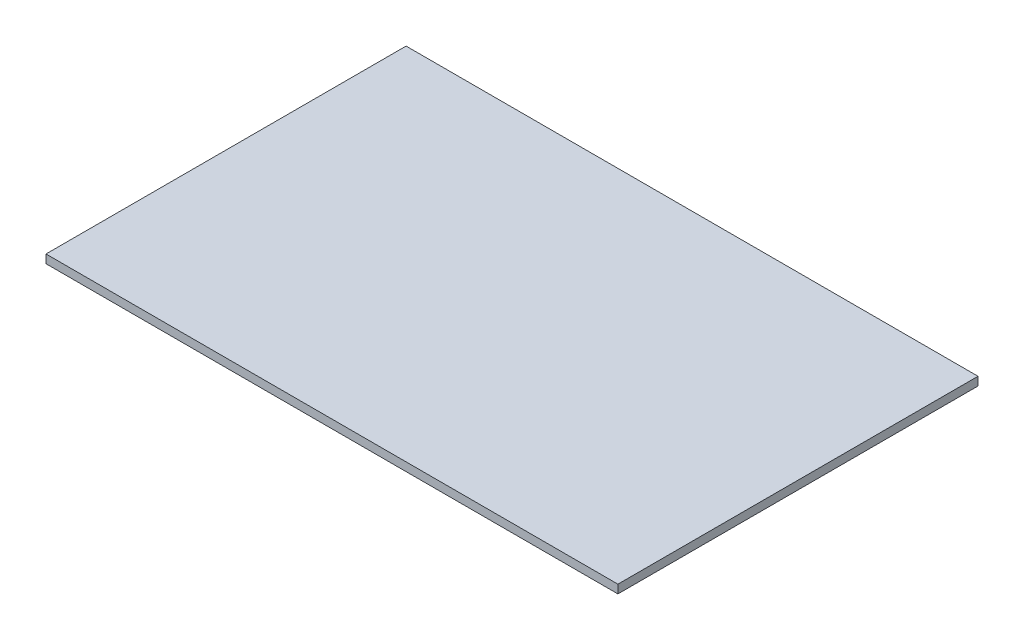
ISO-10303-21;
HEADER;
FILE_DESCRIPTION(('STEP AP214'),'2;1');
FILE_NAME('part.step','',(''),(''),'','','');
FILE_SCHEMA(('AUTOMOTIVE_DESIGN { 1 0 10303 214 1 1 1 1 }'));
ENDSEC;
DATA;
#1=APPLICATION_CONTEXT('core data for automotive mechanical design processes');
#2=APPLICATION_PROTOCOL_DEFINITION('international standard','automotive_design',2000,#1);
#3=PRODUCT_CONTEXT('',#1,'mechanical');
#4=PRODUCT('Part','Part','',(#3));
#5=PRODUCT_RELATED_PRODUCT_CATEGORY('part','',(#4));
#6=PRODUCT_DEFINITION_FORMATION('','',#4);
#7=PRODUCT_DEFINITION_CONTEXT('part definition',#1,'design');
#8=PRODUCT_DEFINITION('design','',#6,#7);
#9=PRODUCT_DEFINITION_SHAPE('','',#8);
#10=(LENGTH_UNIT() NAMED_UNIT(*) SI_UNIT(.MILLI.,.METRE.));
#11=(NAMED_UNIT(*) PLANE_ANGLE_UNIT() SI_UNIT($,.RADIAN.));
#12=(NAMED_UNIT(*) SI_UNIT($,.STERADIAN.) SOLID_ANGLE_UNIT());
#13=UNCERTAINTY_MEASURE_WITH_UNIT(LENGTH_MEASURE(1.E-05),#10,'distance_accuracy_value','');
#14=(GEOMETRIC_REPRESENTATION_CONTEXT(3) GLOBAL_UNCERTAINTY_ASSIGNED_CONTEXT((#13)) GLOBAL_UNIT_ASSIGNED_CONTEXT((#10,
#11,#12)) REPRESENTATION_CONTEXT('',''));
#15=CARTESIAN_POINT('',(0.,0.,0.));
#16=DIRECTION('',(0.,0.,1.));
#17=DIRECTION('',(1.,0.,0.));
#18=AXIS2_PLACEMENT_3D('',#15,#16,#17);
#19=CARTESIAN_POINT('',(67.5,2.,42.5));
#20=DIRECTION('',(-1.,0.,0.));
#21=DIRECTION('',(0.,0.,1.));
#22=AXIS2_PLACEMENT_3D('',#19,#20,#21);
#23=PLANE('',#22);
#24=DIRECTION('',(0.,0.,-1.));
#25=VECTOR('',#24,1.);
#26=CARTESIAN_POINT('',(67.5,0.,42.5));
#27=LINE('',#26,#25);
#28=CARTESIAN_POINT('',(67.5,0.,42.5));
#29=VERTEX_POINT('',#28);
#30=CARTESIAN_POINT('',(67.5,0.,-42.5));
#31=VERTEX_POINT('',#30);
#32=EDGE_CURVE('E100',#29,#31,#27,.T.);
#33=ORIENTED_EDGE('',*,*,#32,.T.);
#34=DIRECTION('',(0.,-1.,0.));
#35=VECTOR('',#34,1.);
#36=CARTESIAN_POINT('',(67.5,2.,-42.5));
#37=LINE('',#36,#35);
#38=CARTESIAN_POINT('',(67.5,2.,-42.5));
#39=VERTEX_POINT('',#38);
#40=EDGE_CURVE('E11',#39,#31,#37,.T.);
#41=ORIENTED_EDGE('',*,*,#40,.F.);
#42=DIRECTION('',(0.,0.,-1.));
#43=VECTOR('',#42,1.);
#44=CARTESIAN_POINT('',(67.5,2.,42.5));
#45=LINE('',#44,#43);
#46=CARTESIAN_POINT('',(67.5,2.,42.5));
#47=VERTEX_POINT('',#46);
#48=EDGE_CURVE('E88',#47,#39,#45,.T.);
#49=ORIENTED_EDGE('',*,*,#48,.F.);
#50=DIRECTION('',(0.,-1.,0.));
#51=VECTOR('',#50,1.);
#52=CARTESIAN_POINT('',(67.5,2.,42.5));
#53=LINE('',#52,#51);
#54=EDGE_CURVE('E96',#47,#29,#53,.T.);
#55=ORIENTED_EDGE('',*,*,#54,.T.);
#56=EDGE_LOOP('',(#33,#41,#49,#55));
#57=FACE_BOUND('',#56,.T.);
#58=ADVANCED_FACE('F37',(#57),#23,.F.);
#59=CARTESIAN_POINT('',(-67.5,2.,-42.5));
#60=DIRECTION('',(0.,0.,1.));
#61=DIRECTION('',(1.,0.,0.));
#62=AXIS2_PLACEMENT_3D('',#59,#60,#61);
#63=PLANE('',#62);
#64=DIRECTION('',(-1.,0.,0.));
#65=VECTOR('',#64,1.);
#66=CARTESIAN_POINT('',(-67.5,0.,-42.5));
#67=LINE('',#66,#65);
#68=CARTESIAN_POINT('',(-67.5,0.,-42.5));
#69=VERTEX_POINT('',#68);
#70=EDGE_CURVE('E92',#31,#69,#67,.T.);
#71=ORIENTED_EDGE('',*,*,#70,.T.);
#72=DIRECTION('',(0.,-1.,0.));
#73=VECTOR('',#72,1.);
#74=CARTESIAN_POINT('',(-67.5,2.,-42.5));
#75=LINE('',#74,#73);
#76=CARTESIAN_POINT('',(-67.5,2.,-42.5));
#77=VERTEX_POINT('',#76);
#78=EDGE_CURVE('E45',#77,#69,#75,.T.);
#79=ORIENTED_EDGE('',*,*,#78,.F.);
#80=DIRECTION('',(-1.,0.,0.));
#81=VECTOR('',#80,1.);
#82=CARTESIAN_POINT('',(-67.5,2.,-42.5));
#83=LINE('',#82,#81);
#84=EDGE_CURVE('E83',#39,#77,#83,.T.);
#85=ORIENTED_EDGE('',*,*,#84,.F.);
#86=ORIENTED_EDGE('',*,*,#40,.T.);
#87=EDGE_LOOP('',(#71,#79,#85,#86));
#88=FACE_BOUND('',#87,.T.);
#89=ADVANCED_FACE('F91',(#88),#63,.F.);
#90=CARTESIAN_POINT('',(-67.5,2.,42.5));
#91=DIRECTION('',(1.,0.,0.));
#92=DIRECTION('',(0.,0.,-1.));
#93=AXIS2_PLACEMENT_3D('',#90,#91,#92);
#94=PLANE('',#93);
#95=DIRECTION('',(0.,0.,1.));
#96=VECTOR('',#95,1.);
#97=CARTESIAN_POINT('',(-67.5,0.,42.5));
#98=LINE('',#97,#96);
#99=CARTESIAN_POINT('',(-67.5,0.,42.5));
#100=VERTEX_POINT('',#99);
#101=EDGE_CURVE('E70',#69,#100,#98,.T.);
#102=ORIENTED_EDGE('',*,*,#101,.T.);
#103=DIRECTION('',(0.,-1.,0.));
#104=VECTOR('',#103,1.);
#105=CARTESIAN_POINT('',(-67.5,2.,42.5));
#106=LINE('',#105,#104);
#107=CARTESIAN_POINT('',(-67.5,2.,42.5));
#108=VERTEX_POINT('',#107);
#109=EDGE_CURVE('E93',#108,#100,#106,.T.);
#110=ORIENTED_EDGE('',*,*,#109,.F.);
#111=DIRECTION('',(0.,0.,1.));
#112=VECTOR('',#111,1.);
#113=CARTESIAN_POINT('',(-67.5,2.,42.5));
#114=LINE('',#113,#112);
#115=EDGE_CURVE('E86',#77,#108,#114,.T.);
#116=ORIENTED_EDGE('',*,*,#115,.F.);
#117=ORIENTED_EDGE('',*,*,#78,.T.);
#118=EDGE_LOOP('',(#102,#110,#116,#117));
#119=FACE_BOUND('',#118,.T.);
#120=ADVANCED_FACE('F94',(#119),#94,.F.);
#121=CARTESIAN_POINT('',(-67.5,2.,42.5));
#122=DIRECTION('',(0.,0.,-1.));
#123=DIRECTION('',(-1.,0.,0.));
#124=AXIS2_PLACEMENT_3D('',#121,#122,#123);
#125=PLANE('',#124);
#126=DIRECTION('',(1.,0.,0.));
#127=VECTOR('',#126,1.);
#128=CARTESIAN_POINT('',(-67.5,0.,42.5));
#129=LINE('',#128,#127);
#130=EDGE_CURVE('E76',#100,#29,#129,.T.);
#131=ORIENTED_EDGE('',*,*,#130,.T.);
#132=ORIENTED_EDGE('',*,*,#54,.F.);
#133=DIRECTION('',(1.,0.,0.));
#134=VECTOR('',#133,1.);
#135=CARTESIAN_POINT('',(-67.5,2.,42.5));
#136=LINE('',#135,#134);
#137=EDGE_CURVE('E53',#108,#47,#136,.T.);
#138=ORIENTED_EDGE('',*,*,#137,.F.);
#139=ORIENTED_EDGE('',*,*,#109,.T.);
#140=EDGE_LOOP('',(#131,#132,#138,#139));
#141=FACE_BOUND('',#140,.T.);
#142=ADVANCED_FACE('F107',(#141),#125,.F.);
#143=CARTESIAN_POINT('',(0.,2.,0.));
#144=DIRECTION('',(0.,-1.,0.));
#145=DIRECTION('',(0.,0.,-1.));
#146=AXIS2_PLACEMENT_3D('',#143,#144,#145);
#147=PLANE('',#146);
#148=ORIENTED_EDGE('',*,*,#48,.T.);
#149=ORIENTED_EDGE('',*,*,#84,.T.);
#150=ORIENTED_EDGE('',*,*,#115,.T.);
#151=ORIENTED_EDGE('',*,*,#137,.T.);
#152=EDGE_LOOP('',(#148,#149,#150,#151));
#153=FACE_BOUND('',#152,.T.);
#154=ADVANCED_FACE('F84',(#153),#147,.F.);
#155=CARTESIAN_POINT('',(0.,0.,0.));
#156=DIRECTION('',(0.,-1.,0.));
#157=DIRECTION('',(0.,0.,-1.));
#158=AXIS2_PLACEMENT_3D('',#155,#156,#157);
#159=PLANE('',#158);
#160=ORIENTED_EDGE('',*,*,#32,.F.);
#161=ORIENTED_EDGE('',*,*,#130,.F.);
#162=ORIENTED_EDGE('',*,*,#101,.F.);
#163=ORIENTED_EDGE('',*,*,#70,.F.);
#164=EDGE_LOOP('',(#160,#161,#162,#163));
#165=FACE_BOUND('',#164,.T.);
#166=ADVANCED_FACE('F110',(#165),#159,.T.);
#167=CLOSED_SHELL('',(#58,#89,#120,#142,#154,#166));
#168=MANIFOLD_SOLID_BREP('B2',#167);
#169=ADVANCED_BREP_SHAPE_REPRESENTATION('',(#18,#168),#14);
#170=SHAPE_DEFINITION_REPRESENTATION(#9,#169);
ENDSEC;
END-ISO-10303-21;
